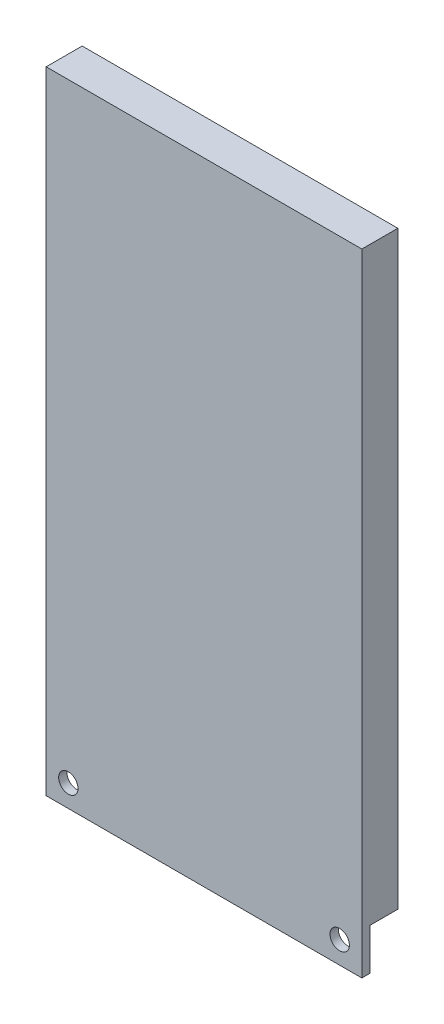
ISO-10303-21;
HEADER;
FILE_DESCRIPTION(('STEP AP214'),'2;1');
FILE_NAME('part.step','',(''),(''),'','','');
FILE_SCHEMA(('AUTOMOTIVE_DESIGN { 1 0 10303 214 1 1 1 1 }'));
ENDSEC;
DATA;
#1=APPLICATION_CONTEXT('core data for automotive mechanical design processes');
#2=APPLICATION_PROTOCOL_DEFINITION('international standard','automotive_design',2000,#1);
#3=PRODUCT_CONTEXT('',#1,'mechanical');
#4=PRODUCT('Part','Part','',(#3));
#5=PRODUCT_RELATED_PRODUCT_CATEGORY('part','',(#4));
#6=PRODUCT_DEFINITION_FORMATION('','',#4);
#7=PRODUCT_DEFINITION_CONTEXT('part definition',#1,'design');
#8=PRODUCT_DEFINITION('design','',#6,#7);
#9=PRODUCT_DEFINITION_SHAPE('','',#8);
#10=(LENGTH_UNIT() NAMED_UNIT(*) SI_UNIT(.MILLI.,.METRE.));
#11=(NAMED_UNIT(*) PLANE_ANGLE_UNIT() SI_UNIT($,.RADIAN.));
#12=(NAMED_UNIT(*) SI_UNIT($,.STERADIAN.) SOLID_ANGLE_UNIT());
#13=UNCERTAINTY_MEASURE_WITH_UNIT(LENGTH_MEASURE(1.E-05),#10,'distance_accuracy_value','');
#14=(GEOMETRIC_REPRESENTATION_CONTEXT(3) GLOBAL_UNCERTAINTY_ASSIGNED_CONTEXT((#13)) GLOBAL_UNIT_ASSIGNED_CONTEXT((#10,
#11,#12)) REPRESENTATION_CONTEXT('',''));
#15=CARTESIAN_POINT('',(0.,0.,0.));
#16=DIRECTION('',(0.,0.,1.));
#17=DIRECTION('',(1.,0.,0.));
#18=AXIS2_PLACEMENT_3D('',#15,#16,#17);
#19=CARTESIAN_POINT('',(0.,0.,1.5));
#20=DIRECTION('',(1.,0.,0.));
#21=DIRECTION('',(0.,1.,0.));
#22=AXIS2_PLACEMENT_3D('',#19,#20,#21);
#23=PLANE('',#22);
#24=DIRECTION('',(0.,0.,-1.));
#25=VECTOR('',#24,1.);
#26=CARTESIAN_POINT('',(0.,114.,1.5));
#27=LINE('',#26,#25);
#28=CARTESIAN_POINT('',(0.,114.,1.5));
#29=VERTEX_POINT('',#28);
#30=CARTESIAN_POINT('',(0.,114.,-5.));
#31=VERTEX_POINT('',#30);
#32=EDGE_CURVE('E181',#29,#31,#27,.T.);
#33=ORIENTED_EDGE('',*,*,#32,.T.);
#34=DIRECTION('',(0.,1.,0.));
#35=VECTOR('',#34,1.);
#36=CARTESIAN_POINT('',(0.,114.,-5.));
#37=LINE('',#36,#35);
#38=CARTESIAN_POINT('',(0.,7.49999999999999,-5.));
#39=VERTEX_POINT('',#38);
#40=EDGE_CURVE('E157',#39,#31,#37,.T.);
#41=ORIENTED_EDGE('',*,*,#40,.F.);
#42=DIRECTION('',(0.,0.,1.));
#43=VECTOR('',#42,1.);
#44=CARTESIAN_POINT('',(0.,7.49999999999999,-5.));
#45=LINE('',#44,#43);
#46=CARTESIAN_POINT('',(0.,7.49999999999999,0.));
#47=VERTEX_POINT('',#46);
#48=EDGE_CURVE('E163',#39,#47,#45,.T.);
#49=ORIENTED_EDGE('',*,*,#48,.T.);
#50=DIRECTION('',(0.,-1.,0.));
#51=VECTOR('',#50,1.);
#52=CARTESIAN_POINT('',(0.,0.,0.));
#53=LINE('',#52,#51);
#54=CARTESIAN_POINT('',(0.,0.,0.));
#55=VERTEX_POINT('',#54);
#56=EDGE_CURVE('E170',#47,#55,#53,.T.);
#57=ORIENTED_EDGE('',*,*,#56,.T.);
#58=DIRECTION('',(0.,0.,-1.));
#59=VECTOR('',#58,1.);
#60=CARTESIAN_POINT('',(0.,0.,1.5));
#61=LINE('',#60,#59);
#62=CARTESIAN_POINT('',(0.,0.,1.5));
#63=VERTEX_POINT('',#62);
#64=EDGE_CURVE('E11',#63,#55,#61,.T.);
#65=ORIENTED_EDGE('',*,*,#64,.F.);
#66=DIRECTION('',(0.,-1.,0.));
#67=VECTOR('',#66,1.);
#68=CARTESIAN_POINT('',(0.,0.,1.5));
#69=LINE('',#68,#67);
#70=EDGE_CURVE('E171',#29,#63,#69,.T.);
#71=ORIENTED_EDGE('',*,*,#70,.F.);
#72=EDGE_LOOP('',(#33,#41,#49,#57,#65,#71));
#73=FACE_BOUND('',#72,.T.);
#74=ADVANCED_FACE('F33',(#73),#23,.F.);
#75=CARTESIAN_POINT('',(0.,0.,1.5));
#76=DIRECTION('',(0.,1.,0.));
#77=DIRECTION('',(0.,0.,1.));
#78=AXIS2_PLACEMENT_3D('',#75,#76,#77);
#79=PLANE('',#78);
#80=DIRECTION('',(1.,0.,0.));
#81=VECTOR('',#80,1.);
#82=CARTESIAN_POINT('',(0.,0.,0.));
#83=LINE('',#82,#81);
#84=CARTESIAN_POINT('',(57.,0.,0.));
#85=VERTEX_POINT('',#84);
#86=EDGE_CURVE('E183',#55,#85,#83,.T.);
#87=ORIENTED_EDGE('',*,*,#86,.T.);
#88=DIRECTION('',(0.,0.,-1.));
#89=VECTOR('',#88,1.);
#90=CARTESIAN_POINT('',(57.,0.,1.5));
#91=LINE('',#90,#89);
#92=CARTESIAN_POINT('',(57.,0.,1.5));
#93=VERTEX_POINT('',#92);
#94=EDGE_CURVE('E40',#93,#85,#91,.T.);
#95=ORIENTED_EDGE('',*,*,#94,.F.);
#96=DIRECTION('',(1.,0.,0.));
#97=VECTOR('',#96,1.);
#98=CARTESIAN_POINT('',(0.,0.,1.5));
#99=LINE('',#98,#97);
#100=EDGE_CURVE('E174',#63,#93,#99,.T.);
#101=ORIENTED_EDGE('',*,*,#100,.F.);
#102=ORIENTED_EDGE('',*,*,#64,.T.);
#103=EDGE_LOOP('',(#87,#95,#101,#102));
#104=FACE_BOUND('',#103,.T.);
#105=ADVANCED_FACE('F199',(#104),#79,.F.);
#106=CARTESIAN_POINT('',(57.,0.,1.5));
#107=DIRECTION('',(-1.,0.,0.));
#108=DIRECTION('',(0.,-1.,0.));
#109=AXIS2_PLACEMENT_3D('',#106,#107,#108);
#110=PLANE('',#109);
#111=DIRECTION('',(0.,1.,0.));
#112=VECTOR('',#111,1.);
#113=CARTESIAN_POINT('',(57.,0.,0.));
#114=LINE('',#113,#112);
#115=CARTESIAN_POINT('',(57.,7.49999999999999,0.));
#116=VERTEX_POINT('',#115);
#117=EDGE_CURVE('E175',#85,#116,#114,.T.);
#118=ORIENTED_EDGE('',*,*,#117,.T.);
#119=DIRECTION('',(0.,0.,1.));
#120=VECTOR('',#119,1.);
#121=CARTESIAN_POINT('',(57.,7.49999999999999,-5.));
#122=LINE('',#121,#120);
#123=CARTESIAN_POINT('',(57.,7.49999999999999,-5.));
#124=VERTEX_POINT('',#123);
#125=EDGE_CURVE('E167',#124,#116,#122,.T.);
#126=ORIENTED_EDGE('',*,*,#125,.F.);
#127=DIRECTION('',(0.,-1.,0.));
#128=VECTOR('',#127,1.);
#129=CARTESIAN_POINT('',(57.,114.,-5.));
#130=LINE('',#129,#128);
#131=CARTESIAN_POINT('',(57.,114.,-5.));
#132=VERTEX_POINT('',#131);
#133=EDGE_CURVE('E152',#132,#124,#130,.T.);
#134=ORIENTED_EDGE('',*,*,#133,.F.);
#135=DIRECTION('',(0.,0.,-1.));
#136=VECTOR('',#135,1.);
#137=CARTESIAN_POINT('',(57.,114.,1.5));
#138=LINE('',#137,#136);
#139=CARTESIAN_POINT('',(57.,114.,1.5));
#140=VERTEX_POINT('',#139);
#141=EDGE_CURVE('E187',#140,#132,#138,.T.);
#142=ORIENTED_EDGE('',*,*,#141,.F.);
#143=DIRECTION('',(0.,1.,0.));
#144=VECTOR('',#143,1.);
#145=CARTESIAN_POINT('',(57.,0.,1.5));
#146=LINE('',#145,#144);
#147=EDGE_CURVE('E177',#93,#140,#146,.T.);
#148=ORIENTED_EDGE('',*,*,#147,.F.);
#149=ORIENTED_EDGE('',*,*,#94,.T.);
#150=EDGE_LOOP('',(#118,#126,#134,#142,#148,#149));
#151=FACE_BOUND('',#150,.T.);
#152=ADVANCED_FACE('F192',(#151),#110,.F.);
#153=CARTESIAN_POINT('',(0.,114.,1.5));
#154=DIRECTION('',(0.,-1.,0.));
#155=DIRECTION('',(0.,0.,-1.));
#156=AXIS2_PLACEMENT_3D('',#153,#154,#155);
#157=PLANE('',#156);
#158=ORIENTED_EDGE('',*,*,#141,.T.);
#159=DIRECTION('',(1.,0.,0.));
#160=VECTOR('',#159,1.);
#161=CARTESIAN_POINT('',(57.,114.,-5.));
#162=LINE('',#161,#160);
#163=EDGE_CURVE('E160',#31,#132,#162,.T.);
#164=ORIENTED_EDGE('',*,*,#163,.F.);
#165=ORIENTED_EDGE('',*,*,#32,.F.);
#166=DIRECTION('',(-1.,0.,0.));
#167=VECTOR('',#166,1.);
#168=CARTESIAN_POINT('',(0.,114.,1.5));
#169=LINE('',#168,#167);
#170=EDGE_CURVE('E179',#140,#29,#169,.T.);
#171=ORIENTED_EDGE('',*,*,#170,.F.);
#172=EDGE_LOOP('',(#158,#164,#165,#171));
#173=FACE_BOUND('',#172,.T.);
#174=ADVANCED_FACE('F212',(#173),#157,.F.);
#175=CARTESIAN_POINT('',(0.,0.,1.5));
#176=DIRECTION('',(0.,0.,-1.));
#177=DIRECTION('',(-1.,0.,0.));
#178=AXIS2_PLACEMENT_3D('',#175,#176,#177);
#179=PLANE('',#178);
#180=CARTESIAN_POINT('',(4.,4.,1.5));
#181=DIRECTION('',(0.,0.,-1.));
#182=DIRECTION('',(-1.,0.,0.));
#183=AXIS2_PLACEMENT_3D('',#180,#181,#182);
#184=CIRCLE('',#183,1.75);
#185=CARTESIAN_POINT('',(2.25,4.,1.5));
#186=VERTEX_POINT('',#185);
#187=EDGE_CURVE('E141',#186,#186,#184,.T.);
#188=ORIENTED_EDGE('',*,*,#187,.T.);
#189=EDGE_LOOP('',(#188));
#190=FACE_BOUND('',#189,.T.);
#191=CARTESIAN_POINT('',(53.,4.,1.5));
#192=DIRECTION('',(0.,0.,-1.));
#193=DIRECTION('',(-1.,0.,0.));
#194=AXIS2_PLACEMENT_3D('',#191,#192,#193);
#195=CIRCLE('',#194,1.75);
#196=CARTESIAN_POINT('',(51.25,4.,1.5));
#197=VERTEX_POINT('',#196);
#198=EDGE_CURVE('E342',#197,#197,#195,.T.);
#199=ORIENTED_EDGE('',*,*,#198,.T.);
#200=EDGE_LOOP('',(#199));
#201=FACE_BOUND('',#200,.T.);
#202=ORIENTED_EDGE('',*,*,#70,.T.);
#203=ORIENTED_EDGE('',*,*,#100,.T.);
#204=ORIENTED_EDGE('',*,*,#147,.T.);
#205=ORIENTED_EDGE('',*,*,#170,.T.);
#206=EDGE_LOOP('',(#202,#203,#204,#205));
#207=FACE_BOUND('',#206,.T.);
#208=ADVANCED_FACE('F214',(#190,#201,#207),#179,.F.);
#209=CARTESIAN_POINT('',(0.,0.,0.));
#210=DIRECTION('',(0.,0.,-1.));
#211=DIRECTION('',(-1.,0.,0.));
#212=AXIS2_PLACEMENT_3D('',#209,#210,#211);
#213=PLANE('',#212);
#214=CARTESIAN_POINT('',(53.,4.,0.));
#215=DIRECTION('',(0.,0.,-1.));
#216=DIRECTION('',(-1.,0.,0.));
#217=AXIS2_PLACEMENT_3D('',#214,#215,#216);
#218=CIRCLE('',#217,1.75);
#219=CARTESIAN_POINT('',(51.25,4.,0.));
#220=VERTEX_POINT('',#219);
#221=EDGE_CURVE('E347',#220,#220,#218,.T.);
#222=ORIENTED_EDGE('',*,*,#221,.F.);
#223=EDGE_LOOP('',(#222));
#224=FACE_BOUND('',#223,.T.);
#225=CARTESIAN_POINT('',(4.,4.,0.));
#226=DIRECTION('',(0.,0.,-1.));
#227=DIRECTION('',(-1.,0.,0.));
#228=AXIS2_PLACEMENT_3D('',#225,#226,#227);
#229=CIRCLE('',#228,1.75);
#230=CARTESIAN_POINT('',(2.25,4.,0.));
#231=VERTEX_POINT('',#230);
#232=EDGE_CURVE('E340',#231,#231,#229,.T.);
#233=ORIENTED_EDGE('',*,*,#232,.F.);
#234=EDGE_LOOP('',(#233));
#235=FACE_BOUND('',#234,.T.);
#236=DIRECTION('',(-1.,0.,0.));
#237=VECTOR('',#236,1.);
#238=CARTESIAN_POINT('',(57.,7.49999999999999,0.));
#239=LINE('',#238,#237);
#240=EDGE_CURVE('E55',#116,#47,#239,.T.);
#241=ORIENTED_EDGE('',*,*,#240,.F.);
#242=ORIENTED_EDGE('',*,*,#117,.F.);
#243=ORIENTED_EDGE('',*,*,#86,.F.);
#244=ORIENTED_EDGE('',*,*,#56,.F.);
#245=EDGE_LOOP('',(#241,#242,#243,#244));
#246=FACE_BOUND('',#245,.T.);
#247=ADVANCED_FACE('F197',(#224,#235,#246),#213,.T.);
#248=CARTESIAN_POINT('',(0.,0.,-5.));
#249=DIRECTION('',(0.,0.,-1.));
#250=DIRECTION('',(-1.,0.,0.));
#251=AXIS2_PLACEMENT_3D('',#248,#249,#250);
#252=PLANE('',#251);
#253=ORIENTED_EDGE('',*,*,#133,.T.);
#254=DIRECTION('',(-1.,0.,0.));
#255=VECTOR('',#254,1.);
#256=CARTESIAN_POINT('',(57.,7.49999999999999,-5.));
#257=LINE('',#256,#255);
#258=EDGE_CURVE('E155',#124,#39,#257,.T.);
#259=ORIENTED_EDGE('',*,*,#258,.T.);
#260=ORIENTED_EDGE('',*,*,#40,.T.);
#261=ORIENTED_EDGE('',*,*,#163,.T.);
#262=EDGE_LOOP('',(#253,#259,#260,#261));
#263=FACE_BOUND('',#262,.T.);
#264=DIRECTION('',(-1.,0.,0.));
#265=VECTOR('',#264,1.);
#266=CARTESIAN_POINT('',(55.,9.5,-5.));
#267=LINE('',#266,#265);
#268=CARTESIAN_POINT('',(55.,9.5,-5.));
#269=VERTEX_POINT('',#268);
#270=CARTESIAN_POINT('',(1.99999999999997,9.5,-5.));
#271=VERTEX_POINT('',#270);
#272=EDGE_CURVE('E119',#269,#271,#267,.T.);
#273=ORIENTED_EDGE('',*,*,#272,.F.);
#274=DIRECTION('',(0.,-1.,0.));
#275=VECTOR('',#274,1.);
#276=CARTESIAN_POINT('',(55.,112.,-5.));
#277=LINE('',#276,#275);
#278=CARTESIAN_POINT('',(55.,112.,-5.));
#279=VERTEX_POINT('',#278);
#280=EDGE_CURVE('E111',#279,#269,#277,.T.);
#281=ORIENTED_EDGE('',*,*,#280,.F.);
#282=DIRECTION('',(1.,0.,0.));
#283=VECTOR('',#282,1.);
#284=CARTESIAN_POINT('',(55.,112.,-5.));
#285=LINE('',#284,#283);
#286=CARTESIAN_POINT('',(1.99999999999998,112.,-5.));
#287=VERTEX_POINT('',#286);
#288=EDGE_CURVE('E134',#287,#279,#285,.T.);
#289=ORIENTED_EDGE('',*,*,#288,.F.);
#290=DIRECTION('',(0.,1.,0.));
#291=VECTOR('',#290,1.);
#292=CARTESIAN_POINT('',(1.99999999999998,112.,-5.));
#293=LINE('',#292,#291);
#294=EDGE_CURVE('E132',#271,#287,#293,.T.);
#295=ORIENTED_EDGE('',*,*,#294,.F.);
#296=EDGE_LOOP('',(#273,#281,#289,#295));
#297=FACE_BOUND('',#296,.T.);
#298=ADVANCED_FACE('F130',(#263,#297),#252,.T.);
#299=CARTESIAN_POINT('',(57.,7.49999999999999,-5.));
#300=DIRECTION('',(0.,1.,0.));
#301=DIRECTION('',(0.,0.,1.));
#302=AXIS2_PLACEMENT_3D('',#299,#300,#301);
#303=PLANE('',#302);
#304=ORIENTED_EDGE('',*,*,#240,.T.);
#305=ORIENTED_EDGE('',*,*,#48,.F.);
#306=ORIENTED_EDGE('',*,*,#258,.F.);
#307=ORIENTED_EDGE('',*,*,#125,.T.);
#308=EDGE_LOOP('',(#304,#305,#306,#307));
#309=FACE_BOUND('',#308,.T.);
#310=ADVANCED_FACE('F205',(#309),#303,.F.);
#311=CARTESIAN_POINT('',(55.,112.,-5.));
#312=DIRECTION('',(-1.,0.,0.));
#313=DIRECTION('',(0.,-1.,0.));
#314=AXIS2_PLACEMENT_3D('',#311,#312,#313);
#315=PLANE('',#314);
#316=DIRECTION('',(0.,-1.,0.));
#317=VECTOR('',#316,1.);
#318=CARTESIAN_POINT('',(55.,112.,0.));
#319=LINE('',#318,#317);
#320=CARTESIAN_POINT('',(55.,112.,0.));
#321=VERTEX_POINT('',#320);
#322=CARTESIAN_POINT('',(55.,9.5,0.));
#323=VERTEX_POINT('',#322);
#324=EDGE_CURVE('E139',#321,#323,#319,.T.);
#325=ORIENTED_EDGE('',*,*,#324,.F.);
#326=DIRECTION('',(0.,0.,1.));
#327=VECTOR('',#326,1.);
#328=CARTESIAN_POINT('',(55.,112.,-5.));
#329=LINE('',#328,#327);
#330=EDGE_CURVE('E47',#279,#321,#329,.T.);
#331=ORIENTED_EDGE('',*,*,#330,.F.);
#332=ORIENTED_EDGE('',*,*,#280,.T.);
#333=DIRECTION('',(0.,0.,1.));
#334=VECTOR('',#333,1.);
#335=CARTESIAN_POINT('',(55.,9.5,-5.));
#336=LINE('',#335,#334);
#337=EDGE_CURVE('E114',#269,#323,#336,.T.);
#338=ORIENTED_EDGE('',*,*,#337,.T.);
#339=EDGE_LOOP('',(#325,#331,#332,#338));
#340=FACE_BOUND('',#339,.T.);
#341=ADVANCED_FACE('F113',(#340),#315,.T.);
#342=CARTESIAN_POINT('',(55.,9.5,-5.));
#343=DIRECTION('',(0.,1.,0.));
#344=DIRECTION('',(0.,0.,1.));
#345=AXIS2_PLACEMENT_3D('',#342,#343,#344);
#346=PLANE('',#345);
#347=DIRECTION('',(-1.,0.,0.));
#348=VECTOR('',#347,1.);
#349=CARTESIAN_POINT('',(55.,9.5,0.));
#350=LINE('',#349,#348);
#351=CARTESIAN_POINT('',(1.99999999999997,9.5,0.));
#352=VERTEX_POINT('',#351);
#353=EDGE_CURVE('E126',#323,#352,#350,.T.);
#354=ORIENTED_EDGE('',*,*,#353,.F.);
#355=ORIENTED_EDGE('',*,*,#337,.F.);
#356=ORIENTED_EDGE('',*,*,#272,.T.);
#357=DIRECTION('',(0.,0.,1.));
#358=VECTOR('',#357,1.);
#359=CARTESIAN_POINT('',(1.99999999999997,9.5,-5.));
#360=LINE('',#359,#358);
#361=EDGE_CURVE('E127',#271,#352,#360,.T.);
#362=ORIENTED_EDGE('',*,*,#361,.T.);
#363=EDGE_LOOP('',(#354,#355,#356,#362));
#364=FACE_BOUND('',#363,.T.);
#365=ADVANCED_FACE('F123',(#364),#346,.T.);
#366=CARTESIAN_POINT('',(1.99999999999998,112.,-5.));
#367=DIRECTION('',(1.,0.,0.));
#368=DIRECTION('',(0.,1.,0.));
#369=AXIS2_PLACEMENT_3D('',#366,#367,#368);
#370=PLANE('',#369);
#371=DIRECTION('',(0.,1.,0.));
#372=VECTOR('',#371,1.);
#373=CARTESIAN_POINT('',(1.99999999999998,112.,0.));
#374=LINE('',#373,#372);
#375=CARTESIAN_POINT('',(1.99999999999998,112.,0.));
#376=VERTEX_POINT('',#375);
#377=EDGE_CURVE('E143',#352,#376,#374,.T.);
#378=ORIENTED_EDGE('',*,*,#377,.F.);
#379=ORIENTED_EDGE('',*,*,#361,.F.);
#380=ORIENTED_EDGE('',*,*,#294,.T.);
#381=DIRECTION('',(0.,0.,1.));
#382=VECTOR('',#381,1.);
#383=CARTESIAN_POINT('',(1.99999999999998,112.,-5.));
#384=LINE('',#383,#382);
#385=EDGE_CURVE('E149',#287,#376,#384,.T.);
#386=ORIENTED_EDGE('',*,*,#385,.T.);
#387=EDGE_LOOP('',(#378,#379,#380,#386));
#388=FACE_BOUND('',#387,.T.);
#389=ADVANCED_FACE('F284',(#388),#370,.T.);
#390=CARTESIAN_POINT('',(55.,112.,-5.));
#391=DIRECTION('',(0.,-1.,0.));
#392=DIRECTION('',(0.,0.,-1.));
#393=AXIS2_PLACEMENT_3D('',#390,#391,#392);
#394=PLANE('',#393);
#395=DIRECTION('',(1.,0.,0.));
#396=VECTOR('',#395,1.);
#397=CARTESIAN_POINT('',(55.,112.,0.));
#398=LINE('',#397,#396);
#399=EDGE_CURVE('E120',#376,#321,#398,.T.);
#400=ORIENTED_EDGE('',*,*,#399,.F.);
#401=ORIENTED_EDGE('',*,*,#385,.F.);
#402=ORIENTED_EDGE('',*,*,#288,.T.);
#403=ORIENTED_EDGE('',*,*,#330,.T.);
#404=EDGE_LOOP('',(#400,#401,#402,#403));
#405=FACE_BOUND('',#404,.T.);
#406=ADVANCED_FACE('F293',(#405),#394,.T.);
#407=ORIENTED_EDGE('',*,*,#399,.T.);
#408=ORIENTED_EDGE('',*,*,#324,.T.);
#409=ORIENTED_EDGE('',*,*,#353,.T.);
#410=ORIENTED_EDGE('',*,*,#377,.T.);
#411=EDGE_LOOP('',(#407,#408,#409,#410));
#412=FACE_BOUND('',#411,.T.);
#413=ADVANCED_FACE('F224',(#412),#213,.T.);
#414=CARTESIAN_POINT('',(53.,4.,7.));
#415=DIRECTION('',(0.,0.,-1.));
#416=DIRECTION('',(-1.,0.,0.));
#417=AXIS2_PLACEMENT_3D('',#414,#415,#416);
#418=CYLINDRICAL_SURFACE('',#417,1.75);
#419=ORIENTED_EDGE('',*,*,#221,.T.);
#420=EDGE_LOOP('',(#419));
#421=FACE_BOUND('',#420,.T.);
#422=ORIENTED_EDGE('',*,*,#198,.F.);
#423=EDGE_LOOP('',(#422));
#424=FACE_BOUND('',#423,.T.);
#425=ADVANCED_FACE('F310',(#421,#424),#418,.F.);
#426=CARTESIAN_POINT('',(4.,4.,7.));
#427=DIRECTION('',(0.,0.,-1.));
#428=DIRECTION('',(-1.,0.,0.));
#429=AXIS2_PLACEMENT_3D('',#426,#427,#428);
#430=CYLINDRICAL_SURFACE('',#429,1.75);
#431=ORIENTED_EDGE('',*,*,#232,.T.);
#432=EDGE_LOOP('',(#431));
#433=FACE_BOUND('',#432,.T.);
#434=ORIENTED_EDGE('',*,*,#187,.F.);
#435=EDGE_LOOP('',(#434));
#436=FACE_BOUND('',#435,.T.);
#437=ADVANCED_FACE('F323',(#433,#436),#430,.F.);
#438=CLOSED_SHELL('',(#74,#105,#152,#174,#208,#247,#298,#310,#341,#365,#389,#406,#413,#425,#437));
#439=MANIFOLD_SOLID_BREP('B2',#438);
#440=ADVANCED_BREP_SHAPE_REPRESENTATION('',(#18,#439),#14);
#441=SHAPE_DEFINITION_REPRESENTATION(#9,#440);
ENDSEC;
END-ISO-10303-21;
